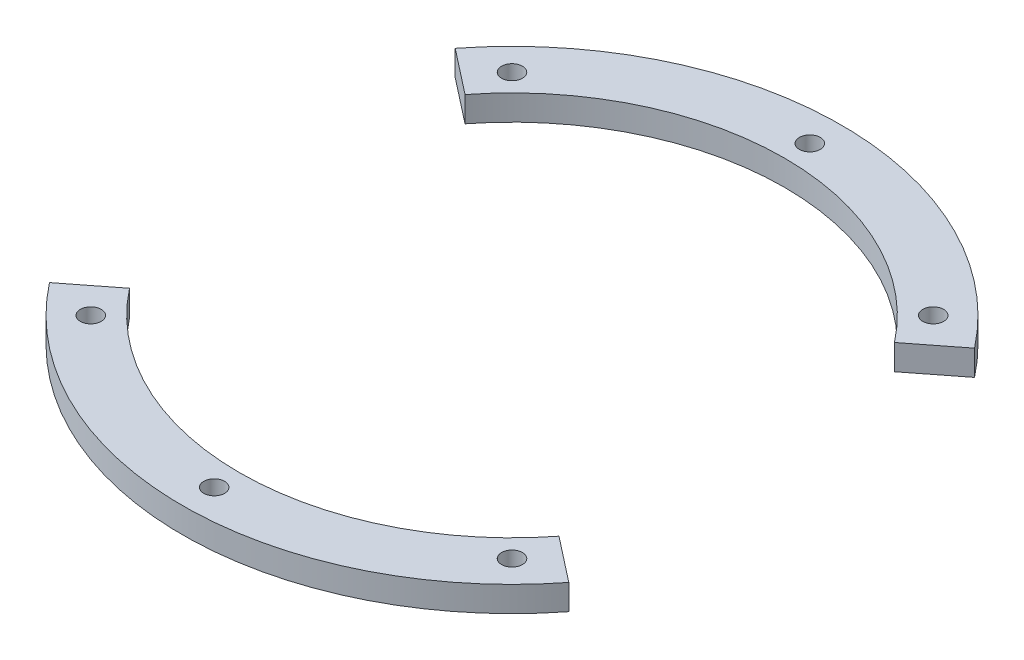
ISO-10303-21;
HEADER;
FILE_DESCRIPTION(('STEP AP214'),'2;1');
FILE_NAME('part.step','',(''),(''),'','','');
FILE_SCHEMA(('AUTOMOTIVE_DESIGN { 1 0 10303 214 1 1 1 1 }'));
ENDSEC;
DATA;
#1=APPLICATION_CONTEXT('core data for automotive mechanical design processes');
#2=APPLICATION_PROTOCOL_DEFINITION('international standard','automotive_design',2000,#1);
#3=PRODUCT_CONTEXT('',#1,'mechanical');
#4=PRODUCT('Part','Part','',(#3));
#5=PRODUCT_RELATED_PRODUCT_CATEGORY('part','',(#4));
#6=PRODUCT_DEFINITION_FORMATION('','',#4);
#7=PRODUCT_DEFINITION_CONTEXT('part definition',#1,'design');
#8=PRODUCT_DEFINITION('design','',#6,#7);
#9=PRODUCT_DEFINITION_SHAPE('','',#8);
#10=(LENGTH_UNIT() NAMED_UNIT(*) SI_UNIT(.MILLI.,.METRE.));
#11=(NAMED_UNIT(*) PLANE_ANGLE_UNIT() SI_UNIT($,.RADIAN.));
#12=(NAMED_UNIT(*) SI_UNIT($,.STERADIAN.) SOLID_ANGLE_UNIT());
#13=UNCERTAINTY_MEASURE_WITH_UNIT(LENGTH_MEASURE(1.E-05),#10,'distance_accuracy_value','');
#14=(GEOMETRIC_REPRESENTATION_CONTEXT(3) GLOBAL_UNCERTAINTY_ASSIGNED_CONTEXT((#13)) GLOBAL_UNIT_ASSIGNED_CONTEXT((#10,
#11,#12)) REPRESENTATION_CONTEXT('',''));
#15=CARTESIAN_POINT('',(0.,0.,0.));
#16=DIRECTION('',(0.,0.,1.));
#17=DIRECTION('',(1.,0.,0.));
#18=AXIS2_PLACEMENT_3D('',#15,#16,#17);
#19=CARTESIAN_POINT('',(0.,4.,0.));
#20=DIRECTION('',(0.,1.,0.));
#21=DIRECTION('',(0.,0.,1.));
#22=AXIS2_PLACEMENT_3D('',#19,#20,#21);
#23=PLANE('',#22);
#24=CARTESIAN_POINT('',(0.,4.,-47.));
#25=DIRECTION('',(0.,1.,0.));
#26=DIRECTION('',(0.,0.,1.));
#27=AXIS2_PLACEMENT_3D('',#24,#25,#26);
#28=CIRCLE('',#27,1.65);
#29=CARTESIAN_POINT('',(0.,4.,-45.35));
#30=VERTEX_POINT('',#29);
#31=EDGE_CURVE('E128',#30,#30,#28,.T.);
#32=ORIENTED_EDGE('',*,*,#31,.F.);
#33=EDGE_LOOP('',(#32));
#34=FACE_BOUND('',#33,.T.);
#35=CARTESIAN_POINT('',(-33.2340187157677,4.,-33.2340187157677));
#36=DIRECTION('',(0.,1.,0.));
#37=DIRECTION('',(0.,0.,1.));
#38=AXIS2_PLACEMENT_3D('',#35,#36,#37);
#39=CIRCLE('',#38,1.65);
#40=CARTESIAN_POINT('',(-33.2340187157677,4.,-31.5840187157677));
#41=VERTEX_POINT('',#40);
#42=EDGE_CURVE('E122',#41,#41,#39,.T.);
#43=ORIENTED_EDGE('',*,*,#42,.F.);
#44=EDGE_LOOP('',(#43));
#45=FACE_BOUND('',#44,.T.);
#46=CARTESIAN_POINT('',(33.2340187157677,4.,-33.2340187157677));
#47=DIRECTION('',(0.,1.,0.));
#48=DIRECTION('',(0.,0.,1.));
#49=AXIS2_PLACEMENT_3D('',#46,#47,#48);
#50=CIRCLE('',#49,1.65);
#51=CARTESIAN_POINT('',(33.2340187157677,4.,-31.5840187157678));
#52=VERTEX_POINT('',#51);
#53=EDGE_CURVE('E135',#52,#52,#50,.T.);
#54=ORIENTED_EDGE('',*,*,#53,.F.);
#55=EDGE_LOOP('',(#54));
#56=FACE_BOUND('',#55,.T.);
#57=CARTESIAN_POINT('',(0.,4.,0.));
#58=DIRECTION('',(0.,1.,0.));
#59=DIRECTION('',(0.,0.,1.));
#60=AXIS2_PLACEMENT_3D('',#57,#58,#59);
#61=CIRCLE('',#60,43.);
#62=CARTESIAN_POINT('',(33.884462405089,4.,-26.4734434390034));
#63=VERTEX_POINT('',#62);
#64=CARTESIAN_POINT('',(-33.884462405089,4.,-26.4734434390033));
#65=VERTEX_POINT('',#64);
#66=EDGE_CURVE('E108',#63,#65,#61,.T.);
#67=ORIENTED_EDGE('',*,*,#66,.F.);
#68=DIRECTION('',(0.788010753606721,0.,-0.61566147532566));
#69=VECTOR('',#68,1.);
#70=CARTESIAN_POINT('',(0.,4.,0.));
#71=LINE('',#70,#69);
#72=CARTESIAN_POINT('',(40.9765591875495,4.,-32.0143967169343));
#73=VERTEX_POINT('',#72);
#74=EDGE_CURVE('E95',#63,#73,#71,.T.);
#75=ORIENTED_EDGE('',*,*,#74,.T.);
#76=CARTESIAN_POINT('',(0.,4.,0.));
#77=DIRECTION('',(0.,1.,0.));
#78=DIRECTION('',(0.,0.,1.));
#79=AXIS2_PLACEMENT_3D('',#76,#77,#78);
#80=CIRCLE('',#79,52.);
#81=CARTESIAN_POINT('',(-40.9765591875495,4.,-32.0143967169343));
#82=VERTEX_POINT('',#81);
#83=EDGE_CURVE('E106',#73,#82,#80,.T.);
#84=ORIENTED_EDGE('',*,*,#83,.T.);
#85=DIRECTION('',(-0.788010753606721,0.,-0.615661475325659));
#86=VECTOR('',#85,1.);
#87=CARTESIAN_POINT('',(0.,4.,0.));
#88=LINE('',#87,#86);
#89=EDGE_CURVE('E101',#65,#82,#88,.T.);
#90=ORIENTED_EDGE('',*,*,#89,.F.);
#91=EDGE_LOOP('',(#67,#75,#84,#90));
#92=FACE_BOUND('',#91,.T.);
#93=ADVANCED_FACE('F61',(#34,#45,#56,#92),#23,.T.);
#94=CARTESIAN_POINT('',(0.,0.,0.));
#95=DIRECTION('',(0.,1.,0.));
#96=DIRECTION('',(0.,0.,1.));
#97=AXIS2_PLACEMENT_3D('',#94,#95,#96);
#98=PLANE('',#97);
#99=CARTESIAN_POINT('',(-33.2340187157677,0.,-33.2340187157677));
#100=DIRECTION('',(0.,1.,0.));
#101=DIRECTION('',(0.,0.,1.));
#102=AXIS2_PLACEMENT_3D('',#99,#100,#101);
#103=CIRCLE('',#102,1.65);
#104=CARTESIAN_POINT('',(-33.2340187157677,0.,-31.5840187157677));
#105=VERTEX_POINT('',#104);
#106=EDGE_CURVE('E114',#105,#105,#103,.T.);
#107=ORIENTED_EDGE('',*,*,#106,.T.);
#108=EDGE_LOOP('',(#107));
#109=FACE_BOUND('',#108,.T.);
#110=CARTESIAN_POINT('',(0.,0.,-47.));
#111=DIRECTION('',(0.,1.,0.));
#112=DIRECTION('',(0.,0.,1.));
#113=AXIS2_PLACEMENT_3D('',#110,#111,#112);
#114=CIRCLE('',#113,1.65);
#115=CARTESIAN_POINT('',(0.,0.,-45.35));
#116=VERTEX_POINT('',#115);
#117=EDGE_CURVE('E117',#116,#116,#114,.T.);
#118=ORIENTED_EDGE('',*,*,#117,.T.);
#119=EDGE_LOOP('',(#118));
#120=FACE_BOUND('',#119,.T.);
#121=CARTESIAN_POINT('',(33.2340187157677,0.,-33.2340187157677));
#122=DIRECTION('',(0.,1.,0.));
#123=DIRECTION('',(0.,0.,1.));
#124=AXIS2_PLACEMENT_3D('',#121,#122,#123);
#125=CIRCLE('',#124,1.65);
#126=CARTESIAN_POINT('',(33.2340187157677,0.,-31.5840187157678));
#127=VERTEX_POINT('',#126);
#128=EDGE_CURVE('E139',#127,#127,#125,.T.);
#129=ORIENTED_EDGE('',*,*,#128,.T.);
#130=EDGE_LOOP('',(#129));
#131=FACE_BOUND('',#130,.T.);
#132=DIRECTION('',(0.788010753606721,0.,-0.61566147532566));
#133=VECTOR('',#132,1.);
#134=CARTESIAN_POINT('',(0.,0.,0.));
#135=LINE('',#134,#133);
#136=CARTESIAN_POINT('',(33.884462405089,0.,-26.4734434390034));
#137=VERTEX_POINT('',#136);
#138=CARTESIAN_POINT('',(40.9765591875495,0.,-32.0143967169343));
#139=VERTEX_POINT('',#138);
#140=EDGE_CURVE('E13',#137,#139,#135,.T.);
#141=ORIENTED_EDGE('',*,*,#140,.F.);
#142=CARTESIAN_POINT('',(0.,0.,0.));
#143=DIRECTION('',(0.,1.,0.));
#144=DIRECTION('',(0.,0.,1.));
#145=AXIS2_PLACEMENT_3D('',#142,#143,#144);
#146=CIRCLE('',#145,43.);
#147=CARTESIAN_POINT('',(-33.884462405089,0.,-26.4734434390033));
#148=VERTEX_POINT('',#147);
#149=EDGE_CURVE('E64',#137,#148,#146,.T.);
#150=ORIENTED_EDGE('',*,*,#149,.T.);
#151=DIRECTION('',(-0.788010753606721,0.,-0.615661475325659));
#152=VECTOR('',#151,1.);
#153=CARTESIAN_POINT('',(0.,0.,0.));
#154=LINE('',#153,#152);
#155=CARTESIAN_POINT('',(-40.9765591875495,0.,-32.0143967169343));
#156=VERTEX_POINT('',#155);
#157=EDGE_CURVE('E121',#148,#156,#154,.T.);
#158=ORIENTED_EDGE('',*,*,#157,.T.);
#159=CARTESIAN_POINT('',(0.,0.,0.));
#160=DIRECTION('',(0.,1.,0.));
#161=DIRECTION('',(0.,0.,1.));
#162=AXIS2_PLACEMENT_3D('',#159,#160,#161);
#163=CIRCLE('',#162,52.);
#164=EDGE_CURVE('E120',#139,#156,#163,.T.);
#165=ORIENTED_EDGE('',*,*,#164,.F.);
#166=EDGE_LOOP('',(#141,#150,#158,#165));
#167=FACE_BOUND('',#166,.T.);
#168=ADVANCED_FACE('F153',(#109,#120,#131,#167),#98,.F.);
#169=CARTESIAN_POINT('',(0.,4.,0.));
#170=DIRECTION('',(0.,-1.,0.));
#171=DIRECTION('',(0.,0.,-1.));
#172=AXIS2_PLACEMENT_3D('',#169,#170,#171);
#173=CYLINDRICAL_SURFACE('',#172,52.);
#174=DIRECTION('',(0.,-1.,0.));
#175=VECTOR('',#174,1.);
#176=CARTESIAN_POINT('',(40.9765591875495,4.,-32.0143967169343));
#177=LINE('',#176,#175);
#178=EDGE_CURVE('E70',#139,#73,#177,.F.);
#179=ORIENTED_EDGE('',*,*,#178,.F.);
#180=ORIENTED_EDGE('',*,*,#164,.T.);
#181=DIRECTION('',(0.,-1.,0.));
#182=VECTOR('',#181,1.);
#183=CARTESIAN_POINT('',(-40.9765591875495,4.,-32.0143967169343));
#184=LINE('',#183,#182);
#185=EDGE_CURVE('E113',#156,#82,#184,.F.);
#186=ORIENTED_EDGE('',*,*,#185,.T.);
#187=ORIENTED_EDGE('',*,*,#83,.F.);
#188=EDGE_LOOP('',(#179,#180,#186,#187));
#189=FACE_BOUND('',#188,.T.);
#190=ADVANCED_FACE('F111',(#189),#173,.T.);
#191=CARTESIAN_POINT('',(0.,4.,0.));
#192=DIRECTION('',(0.,-1.,0.));
#193=DIRECTION('',(0.,0.,-1.));
#194=AXIS2_PLACEMENT_3D('',#191,#192,#193);
#195=CYLINDRICAL_SURFACE('',#194,43.);
#196=ORIENTED_EDGE('',*,*,#149,.F.);
#197=DIRECTION('',(0.,-1.,0.));
#198=VECTOR('',#197,1.);
#199=CARTESIAN_POINT('',(33.884462405089,4.,-26.4734434390034));
#200=LINE('',#199,#198);
#201=EDGE_CURVE('E123',#137,#63,#200,.F.);
#202=ORIENTED_EDGE('',*,*,#201,.T.);
#203=ORIENTED_EDGE('',*,*,#66,.T.);
#204=DIRECTION('',(0.,-1.,0.));
#205=VECTOR('',#204,1.);
#206=CARTESIAN_POINT('',(-33.884462405089,4.,-26.4734434390033));
#207=LINE('',#206,#205);
#208=EDGE_CURVE('E134',#148,#65,#207,.F.);
#209=ORIENTED_EDGE('',*,*,#208,.F.);
#210=EDGE_LOOP('',(#196,#202,#203,#209));
#211=FACE_BOUND('',#210,.T.);
#212=ADVANCED_FACE('F151',(#211),#195,.F.);
#213=CARTESIAN_POINT('',(-33.2340187157677,4.,-33.2340187157677));
#214=DIRECTION('',(0.,-1.,0.));
#215=DIRECTION('',(0.,0.,-1.));
#216=AXIS2_PLACEMENT_3D('',#213,#214,#215);
#217=CYLINDRICAL_SURFACE('',#216,1.65);
#218=ORIENTED_EDGE('',*,*,#42,.T.);
#219=EDGE_LOOP('',(#218));
#220=FACE_BOUND('',#219,.T.);
#221=ORIENTED_EDGE('',*,*,#106,.F.);
#222=EDGE_LOOP('',(#221));
#223=FACE_BOUND('',#222,.T.);
#224=ADVANCED_FACE('F165',(#220,#223),#217,.F.);
#225=CARTESIAN_POINT('',(0.,4.,-47.));
#226=DIRECTION('',(0.,-1.,0.));
#227=DIRECTION('',(0.,0.,-1.));
#228=AXIS2_PLACEMENT_3D('',#225,#226,#227);
#229=CYLINDRICAL_SURFACE('',#228,1.65);
#230=ORIENTED_EDGE('',*,*,#31,.T.);
#231=EDGE_LOOP('',(#230));
#232=FACE_BOUND('',#231,.T.);
#233=ORIENTED_EDGE('',*,*,#117,.F.);
#234=EDGE_LOOP('',(#233));
#235=FACE_BOUND('',#234,.T.);
#236=ADVANCED_FACE('F174',(#232,#235),#229,.F.);
#237=CARTESIAN_POINT('',(33.2340187157677,4.,-33.2340187157677));
#238=DIRECTION('',(0.,-1.,0.));
#239=DIRECTION('',(0.,0.,-1.));
#240=AXIS2_PLACEMENT_3D('',#237,#238,#239);
#241=CYLINDRICAL_SURFACE('',#240,1.65);
#242=ORIENTED_EDGE('',*,*,#53,.T.);
#243=EDGE_LOOP('',(#242));
#244=FACE_BOUND('',#243,.T.);
#245=ORIENTED_EDGE('',*,*,#128,.F.);
#246=EDGE_LOOP('',(#245));
#247=FACE_BOUND('',#246,.T.);
#248=ADVANCED_FACE('F171',(#244,#247),#241,.F.);
#249=CARTESIAN_POINT('',(0.,-6.,0.));
#250=DIRECTION('',(0.615661475325659,0.,-0.788010753606721));
#251=DIRECTION('',(-0.788010753606721,0.,-0.615661475325659));
#252=AXIS2_PLACEMENT_3D('',#249,#250,#251);
#253=PLANE('',#252);
#254=ORIENTED_EDGE('',*,*,#157,.F.);
#255=ORIENTED_EDGE('',*,*,#208,.T.);
#256=ORIENTED_EDGE('',*,*,#89,.T.);
#257=ORIENTED_EDGE('',*,*,#185,.F.);
#258=EDGE_LOOP('',(#254,#255,#256,#257));
#259=FACE_BOUND('',#258,.T.);
#260=ADVANCED_FACE('F150',(#259),#253,.F.);
#261=CARTESIAN_POINT('',(0.,-6.,0.));
#262=DIRECTION('',(0.61566147532566,0.,0.788010753606721));
#263=DIRECTION('',(0.788010753606721,0.,-0.61566147532566));
#264=AXIS2_PLACEMENT_3D('',#261,#262,#263);
#265=PLANE('',#264);
#266=ORIENTED_EDGE('',*,*,#178,.T.);
#267=ORIENTED_EDGE('',*,*,#74,.F.);
#268=ORIENTED_EDGE('',*,*,#201,.F.);
#269=ORIENTED_EDGE('',*,*,#140,.T.);
#270=EDGE_LOOP('',(#266,#267,#268,#269));
#271=FACE_BOUND('',#270,.T.);
#272=ADVANCED_FACE('F97',(#271),#265,.T.);
#273=CLOSED_SHELL('',(#93,#168,#190,#212,#224,#236,#248,#260,#272));
#274=MANIFOLD_SOLID_BREP('B2',#273);
#275=CARTESIAN_POINT('',(-33.2340187157677,4.,33.2340187157677));
#276=DIRECTION('',(0.,-1.,0.));
#277=DIRECTION('',(0.,0.,-1.));
#278=AXIS2_PLACEMENT_3D('',#275,#276,#277);
#279=CYLINDRICAL_SURFACE('',#278,1.65);
#280=CARTESIAN_POINT('',(-33.2340187157677,4.,33.2340187157677));
#281=DIRECTION('',(0.,1.,0.));
#282=DIRECTION('',(0.,0.,1.));
#283=AXIS2_PLACEMENT_3D('',#280,#281,#282);
#284=CIRCLE('',#283,1.65);
#285=CARTESIAN_POINT('',(-33.2340187157677,4.,34.8840187157677));
#286=VERTEX_POINT('',#285);
#287=EDGE_CURVE('E327',#286,#286,#284,.T.);
#288=ORIENTED_EDGE('',*,*,#287,.T.);
#289=EDGE_LOOP('',(#288));
#290=FACE_BOUND('',#289,.T.);
#291=CARTESIAN_POINT('',(-33.2340187157677,0.,33.2340187157677));
#292=DIRECTION('',(0.,1.,0.));
#293=DIRECTION('',(0.,0.,1.));
#294=AXIS2_PLACEMENT_3D('',#291,#292,#293);
#295=CIRCLE('',#294,1.65);
#296=CARTESIAN_POINT('',(-33.2340187157677,0.,34.8840187157677));
#297=VERTEX_POINT('',#296);
#298=EDGE_CURVE('E330',#297,#297,#295,.T.);
#299=ORIENTED_EDGE('',*,*,#298,.F.);
#300=EDGE_LOOP('',(#299));
#301=FACE_BOUND('',#300,.T.);
#302=ADVANCED_FACE('F254',(#290,#301),#279,.F.);
#303=CARTESIAN_POINT('',(0.,4.,47.));
#304=DIRECTION('',(0.,-1.,0.));
#305=DIRECTION('',(0.,0.,-1.));
#306=AXIS2_PLACEMENT_3D('',#303,#304,#305);
#307=CYLINDRICAL_SURFACE('',#306,1.65);
#308=CARTESIAN_POINT('',(0.,4.,47.));
#309=DIRECTION('',(0.,1.,0.));
#310=DIRECTION('',(0.,0.,1.));
#311=AXIS2_PLACEMENT_3D('',#308,#309,#310);
#312=CIRCLE('',#311,1.65);
#313=CARTESIAN_POINT('',(0.,4.,48.65));
#314=VERTEX_POINT('',#313);
#315=EDGE_CURVE('E321',#314,#314,#312,.T.);
#316=ORIENTED_EDGE('',*,*,#315,.T.);
#317=EDGE_LOOP('',(#316));
#318=FACE_BOUND('',#317,.T.);
#319=CARTESIAN_POINT('',(0.,0.,47.));
#320=DIRECTION('',(0.,1.,0.));
#321=DIRECTION('',(0.,0.,1.));
#322=AXIS2_PLACEMENT_3D('',#319,#320,#321);
#323=CIRCLE('',#322,1.65);
#324=CARTESIAN_POINT('',(0.,0.,48.65));
#325=VERTEX_POINT('',#324);
#326=EDGE_CURVE('E324',#325,#325,#323,.T.);
#327=ORIENTED_EDGE('',*,*,#326,.F.);
#328=EDGE_LOOP('',(#327));
#329=FACE_BOUND('',#328,.T.);
#330=ADVANCED_FACE('F357',(#318,#329),#307,.F.);
#331=CARTESIAN_POINT('',(33.2340187157677,4.,33.2340187157677));
#332=DIRECTION('',(0.,-1.,0.));
#333=DIRECTION('',(0.,0.,-1.));
#334=AXIS2_PLACEMENT_3D('',#331,#332,#333);
#335=CYLINDRICAL_SURFACE('',#334,1.65);
#336=CARTESIAN_POINT('',(33.2340187157677,4.,33.2340187157677));
#337=DIRECTION('',(0.,1.,0.));
#338=DIRECTION('',(0.,0.,1.));
#339=AXIS2_PLACEMENT_3D('',#336,#337,#338);
#340=CIRCLE('',#339,1.65);
#341=CARTESIAN_POINT('',(33.2340187157677,4.,34.8840187157677));
#342=VERTEX_POINT('',#341);
#343=EDGE_CURVE('E314',#342,#342,#340,.T.);
#344=ORIENTED_EDGE('',*,*,#343,.T.);
#345=EDGE_LOOP('',(#344));
#346=FACE_BOUND('',#345,.T.);
#347=CARTESIAN_POINT('',(33.2340187157677,0.,33.2340187157677));
#348=DIRECTION('',(0.,1.,0.));
#349=DIRECTION('',(0.,0.,1.));
#350=AXIS2_PLACEMENT_3D('',#347,#348,#349);
#351=CIRCLE('',#350,1.65);
#352=CARTESIAN_POINT('',(33.2340187157677,0.,34.8840187157677));
#353=VERTEX_POINT('',#352);
#354=EDGE_CURVE('E317',#353,#353,#351,.T.);
#355=ORIENTED_EDGE('',*,*,#354,.F.);
#356=EDGE_LOOP('',(#355));
#357=FACE_BOUND('',#356,.T.);
#358=ADVANCED_FACE('F351',(#346,#357),#335,.F.);
#359=CARTESIAN_POINT('',(0.,-6.,0.));
#360=DIRECTION('',(-0.615661475325659,0.,-0.788010753606721));
#361=DIRECTION('',(-0.788010753606721,0.,0.615661475325659));
#362=AXIS2_PLACEMENT_3D('',#359,#360,#361);
#363=PLANE('',#362);
#364=DIRECTION('',(0.,-1.,0.));
#365=VECTOR('',#364,1.);
#366=CARTESIAN_POINT('',(-40.9765591875495,4.,32.0143967169343));
#367=LINE('',#366,#365);
#368=CARTESIAN_POINT('',(-40.9765591875495,0.,32.0143967169343));
#369=VERTEX_POINT('',#368);
#370=CARTESIAN_POINT('',(-40.9765591875495,4.,32.0143967169343));
#371=VERTEX_POINT('',#370);
#372=EDGE_CURVE('E333',#369,#371,#367,.F.);
#373=ORIENTED_EDGE('',*,*,#372,.T.);
#374=DIRECTION('',(-0.788010753606721,0.,0.615661475325659));
#375=VECTOR('',#374,1.);
#376=CARTESIAN_POINT('',(0.,4.,0.));
#377=LINE('',#376,#375);
#378=CARTESIAN_POINT('',(-33.884462405089,4.,26.4734434390033));
#379=VERTEX_POINT('',#378);
#380=EDGE_CURVE('E276',#379,#371,#377,.T.);
#381=ORIENTED_EDGE('',*,*,#380,.F.);
#382=DIRECTION('',(0.,-1.,0.));
#383=VECTOR('',#382,1.);
#384=CARTESIAN_POINT('',(-33.884462405089,4.,26.4734434390033));
#385=LINE('',#384,#383);
#386=CARTESIAN_POINT('',(-33.884462405089,0.,26.4734434390033));
#387=VERTEX_POINT('',#386);
#388=EDGE_CURVE('E262',#387,#379,#385,.F.);
#389=ORIENTED_EDGE('',*,*,#388,.F.);
#390=DIRECTION('',(-0.788010753606721,0.,0.615661475325659));
#391=VECTOR('',#390,1.);
#392=CARTESIAN_POINT('',(0.,0.,0.));
#393=LINE('',#392,#391);
#394=EDGE_CURVE('E337',#387,#369,#393,.T.);
#395=ORIENTED_EDGE('',*,*,#394,.T.);
#396=EDGE_LOOP('',(#373,#381,#389,#395));
#397=FACE_BOUND('',#396,.T.);
#398=ADVANCED_FACE('F349',(#397),#363,.T.);
#399=CARTESIAN_POINT('',(0.,4.,0.));
#400=DIRECTION('',(0.,-1.,0.));
#401=DIRECTION('',(0.,0.,-1.));
#402=AXIS2_PLACEMENT_3D('',#399,#400,#401);
#403=CYLINDRICAL_SURFACE('',#402,52.);
#404=CARTESIAN_POINT('',(0.,0.,0.));
#405=DIRECTION('',(0.,1.,0.));
#406=DIRECTION('',(0.,0.,1.));
#407=AXIS2_PLACEMENT_3D('',#404,#405,#406);
#408=CIRCLE('',#407,52.);
#409=CARTESIAN_POINT('',(40.9765591875495,0.,32.0143967169343));
#410=VERTEX_POINT('',#409);
#411=EDGE_CURVE('E309',#369,#410,#408,.T.);
#412=ORIENTED_EDGE('',*,*,#411,.T.);
#413=DIRECTION('',(0.,-1.,0.));
#414=VECTOR('',#413,1.);
#415=CARTESIAN_POINT('',(40.9765591875495,4.,32.0143967169343));
#416=LINE('',#415,#414);
#417=CARTESIAN_POINT('',(40.9765591875495,4.,32.0143967169343));
#418=VERTEX_POINT('',#417);
#419=EDGE_CURVE('E340',#410,#418,#416,.F.);
#420=ORIENTED_EDGE('',*,*,#419,.T.);
#421=CARTESIAN_POINT('',(0.,4.,0.));
#422=DIRECTION('',(0.,1.,0.));
#423=DIRECTION('',(0.,0.,1.));
#424=AXIS2_PLACEMENT_3D('',#421,#422,#423);
#425=CIRCLE('',#424,52.);
#426=EDGE_CURVE('E306',#371,#418,#425,.T.);
#427=ORIENTED_EDGE('',*,*,#426,.F.);
#428=ORIENTED_EDGE('',*,*,#372,.F.);
#429=EDGE_LOOP('',(#412,#420,#427,#428));
#430=FACE_BOUND('',#429,.T.);
#431=ADVANCED_FACE('F256',(#430),#403,.T.);
#432=CARTESIAN_POINT('',(0.,4.,0.));
#433=DIRECTION('',(0.,-1.,0.));
#434=DIRECTION('',(0.,0.,-1.));
#435=AXIS2_PLACEMENT_3D('',#432,#433,#434);
#436=CYLINDRICAL_SURFACE('',#435,43.);
#437=DIRECTION('',(0.,-1.,0.));
#438=VECTOR('',#437,1.);
#439=CARTESIAN_POINT('',(33.884462405089,4.,26.4734434390034));
#440=LINE('',#439,#438);
#441=CARTESIAN_POINT('',(33.884462405089,0.,26.4734434390034));
#442=VERTEX_POINT('',#441);
#443=CARTESIAN_POINT('',(33.884462405089,4.,26.4734434390034));
#444=VERTEX_POINT('',#443);
#445=EDGE_CURVE('E59',#442,#444,#440,.F.);
#446=ORIENTED_EDGE('',*,*,#445,.F.);
#447=CARTESIAN_POINT('',(0.,0.,0.));
#448=DIRECTION('',(0.,1.,0.));
#449=DIRECTION('',(0.,0.,1.));
#450=AXIS2_PLACEMENT_3D('',#447,#448,#449);
#451=CIRCLE('',#450,43.);
#452=EDGE_CURVE('E310',#387,#442,#451,.T.);
#453=ORIENTED_EDGE('',*,*,#452,.F.);
#454=ORIENTED_EDGE('',*,*,#388,.T.);
#455=CARTESIAN_POINT('',(0.,4.,0.));
#456=DIRECTION('',(0.,1.,0.));
#457=DIRECTION('',(0.,0.,1.));
#458=AXIS2_PLACEMENT_3D('',#455,#456,#457);
#459=CIRCLE('',#458,43.);
#460=EDGE_CURVE('E304',#379,#444,#459,.T.);
#461=ORIENTED_EDGE('',*,*,#460,.T.);
#462=EDGE_LOOP('',(#446,#453,#454,#461));
#463=FACE_BOUND('',#462,.T.);
#464=ADVANCED_FACE('F308',(#463),#436,.F.);
#465=CARTESIAN_POINT('',(0.,0.,0.));
#466=DIRECTION('',(0.,1.,0.));
#467=DIRECTION('',(0.,0.,1.));
#468=AXIS2_PLACEMENT_3D('',#465,#466,#467);
#469=PLANE('',#468);
#470=ORIENTED_EDGE('',*,*,#452,.T.);
#471=DIRECTION('',(0.788010753606721,0.,0.61566147532566));
#472=VECTOR('',#471,1.);
#473=CARTESIAN_POINT('',(0.,0.,0.));
#474=LINE('',#473,#472);
#475=EDGE_CURVE('E268',#442,#410,#474,.T.);
#476=ORIENTED_EDGE('',*,*,#475,.T.);
#477=ORIENTED_EDGE('',*,*,#411,.F.);
#478=ORIENTED_EDGE('',*,*,#394,.F.);
#479=EDGE_LOOP('',(#470,#476,#477,#478));
#480=FACE_BOUND('',#479,.T.);
#481=ORIENTED_EDGE('',*,*,#354,.T.);
#482=EDGE_LOOP('',(#481));
#483=FACE_BOUND('',#482,.T.);
#484=ORIENTED_EDGE('',*,*,#326,.T.);
#485=EDGE_LOOP('',(#484));
#486=FACE_BOUND('',#485,.T.);
#487=ORIENTED_EDGE('',*,*,#298,.T.);
#488=EDGE_LOOP('',(#487));
#489=FACE_BOUND('',#488,.T.);
#490=ADVANCED_FACE('F344',(#480,#483,#486,#489),#469,.F.);
#491=CARTESIAN_POINT('',(0.,4.,0.));
#492=DIRECTION('',(0.,1.,0.));
#493=DIRECTION('',(0.,0.,1.));
#494=AXIS2_PLACEMENT_3D('',#491,#492,#493);
#495=PLANE('',#494);
#496=DIRECTION('',(0.788010753606721,0.,0.61566147532566));
#497=VECTOR('',#496,1.);
#498=CARTESIAN_POINT('',(0.,4.,0.));
#499=LINE('',#498,#497);
#500=EDGE_CURVE('E293',#444,#418,#499,.T.);
#501=ORIENTED_EDGE('',*,*,#500,.F.);
#502=ORIENTED_EDGE('',*,*,#460,.F.);
#503=ORIENTED_EDGE('',*,*,#380,.T.);
#504=ORIENTED_EDGE('',*,*,#426,.T.);
#505=EDGE_LOOP('',(#501,#502,#503,#504));
#506=FACE_BOUND('',#505,.T.);
#507=ORIENTED_EDGE('',*,*,#315,.F.);
#508=EDGE_LOOP('',(#507));
#509=FACE_BOUND('',#508,.T.);
#510=ORIENTED_EDGE('',*,*,#343,.F.);
#511=EDGE_LOOP('',(#510));
#512=FACE_BOUND('',#511,.T.);
#513=ORIENTED_EDGE('',*,*,#287,.F.);
#514=EDGE_LOOP('',(#513));
#515=FACE_BOUND('',#514,.T.);
#516=ADVANCED_FACE('F302',(#506,#509,#512,#515),#495,.T.);
#517=CARTESIAN_POINT('',(0.,-6.,0.));
#518=DIRECTION('',(-0.61566147532566,0.,0.788010753606721));
#519=DIRECTION('',(0.788010753606721,0.,0.61566147532566));
#520=AXIS2_PLACEMENT_3D('',#517,#518,#519);
#521=PLANE('',#520);
#522=ORIENTED_EDGE('',*,*,#475,.F.);
#523=ORIENTED_EDGE('',*,*,#445,.T.);
#524=ORIENTED_EDGE('',*,*,#500,.T.);
#525=ORIENTED_EDGE('',*,*,#419,.F.);
#526=EDGE_LOOP('',(#522,#523,#524,#525));
#527=FACE_BOUND('',#526,.T.);
#528=ADVANCED_FACE('F292',(#527),#521,.F.);
#529=CLOSED_SHELL('',(#302,#330,#358,#398,#431,#464,#490,#516,#528));
#530=MANIFOLD_SOLID_BREP('B7',#529);
#531=ADVANCED_BREP_SHAPE_REPRESENTATION('',(#18,#274,#530),#14);
#532=SHAPE_DEFINITION_REPRESENTATION(#9,#531);
ENDSEC;
END-ISO-10303-21;
